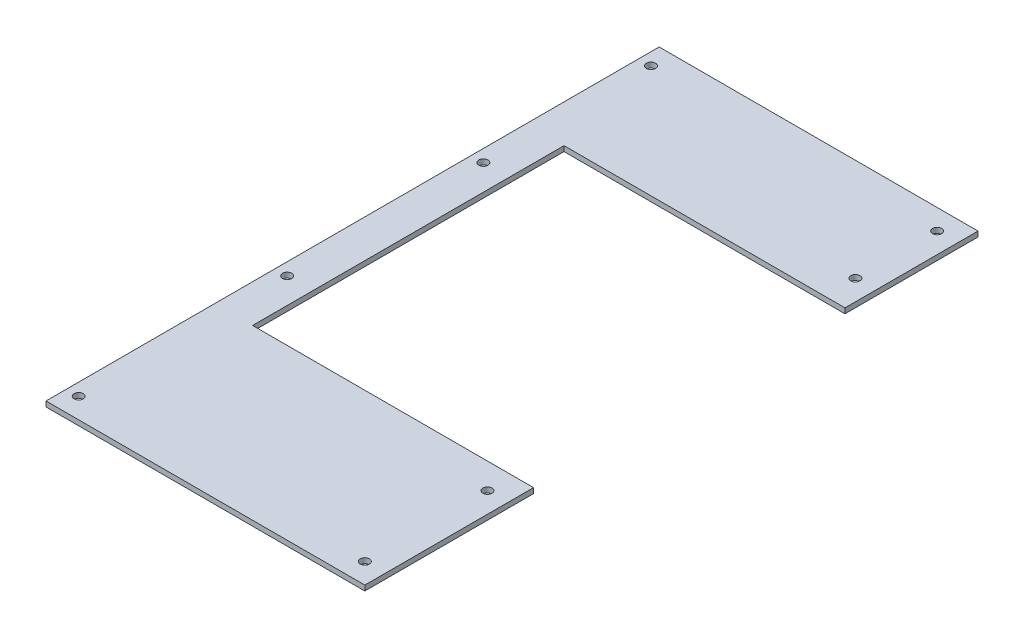
ISO-10303-21;
HEADER;
FILE_DESCRIPTION(('STEP AP214'),'2;1');
FILE_NAME('part.step','',(''),(''),'','','');
FILE_SCHEMA(('AUTOMOTIVE_DESIGN { 1 0 10303 214 1 1 1 1 }'));
ENDSEC;
DATA;
#1=APPLICATION_CONTEXT('core data for automotive mechanical design processes');
#2=APPLICATION_PROTOCOL_DEFINITION('international standard','automotive_design',2000,#1);
#3=PRODUCT_CONTEXT('',#1,'mechanical');
#4=PRODUCT('Part','Part','',(#3));
#5=PRODUCT_RELATED_PRODUCT_CATEGORY('part','',(#4));
#6=PRODUCT_DEFINITION_FORMATION('','',#4);
#7=PRODUCT_DEFINITION_CONTEXT('part definition',#1,'design');
#8=PRODUCT_DEFINITION('design','',#6,#7);
#9=PRODUCT_DEFINITION_SHAPE('','',#8);
#10=(LENGTH_UNIT() NAMED_UNIT(*) SI_UNIT(.MILLI.,.METRE.));
#11=(NAMED_UNIT(*) PLANE_ANGLE_UNIT() SI_UNIT($,.RADIAN.));
#12=(NAMED_UNIT(*) SI_UNIT($,.STERADIAN.) SOLID_ANGLE_UNIT());
#13=UNCERTAINTY_MEASURE_WITH_UNIT(LENGTH_MEASURE(1.E-05),#10,'distance_accuracy_value','');
#14=(GEOMETRIC_REPRESENTATION_CONTEXT(3) GLOBAL_UNCERTAINTY_ASSIGNED_CONTEXT((#13)) GLOBAL_UNIT_ASSIGNED_CONTEXT((#10,
#11,#12)) REPRESENTATION_CONTEXT('',''));
#15=CARTESIAN_POINT('',(0.,0.,0.));
#16=DIRECTION('',(0.,0.,1.));
#17=DIRECTION('',(1.,0.,0.));
#18=AXIS2_PLACEMENT_3D('',#15,#16,#17);
#19=CARTESIAN_POINT('',(0.,3.175,0.));
#20=DIRECTION('',(1.,0.,0.));
#21=DIRECTION('',(0.,0.,-1.));
#22=AXIS2_PLACEMENT_3D('',#19,#20,#21);
#23=PLANE('',#22);
#24=DIRECTION('',(0.,0.,1.));
#25=VECTOR('',#24,1.);
#26=CARTESIAN_POINT('',(0.,0.,0.));
#27=LINE('',#26,#25);
#28=CARTESIAN_POINT('',(0.,0.,0.));
#29=VERTEX_POINT('',#28);
#30=CARTESIAN_POINT('',(0.,0.,81.3500000000002));
#31=VERTEX_POINT('',#30);
#32=EDGE_CURVE('E197',#29,#31,#27,.T.);
#33=ORIENTED_EDGE('',*,*,#32,.F.);
#34=DIRECTION('',(0.,-1.,0.));
#35=VECTOR('',#34,1.);
#36=CARTESIAN_POINT('',(0.,3.175,0.));
#37=LINE('',#36,#35);
#38=CARTESIAN_POINT('',(0.,3.175,0.));
#39=VERTEX_POINT('',#38);
#40=EDGE_CURVE('E11',#39,#29,#37,.T.);
#41=ORIENTED_EDGE('',*,*,#40,.F.);
#42=DIRECTION('',(0.,0.,1.));
#43=VECTOR('',#42,1.);
#44=CARTESIAN_POINT('',(0.,3.175,0.));
#45=LINE('',#44,#43);
#46=CARTESIAN_POINT('',(0.,3.175,81.3500000000002));
#47=VERTEX_POINT('',#46);
#48=EDGE_CURVE('E153',#39,#47,#45,.T.);
#49=ORIENTED_EDGE('',*,*,#48,.T.);
#50=DIRECTION('',(0.,1.,0.));
#51=VECTOR('',#50,1.);
#52=CARTESIAN_POINT('',(0.,0.,81.3500000000002));
#53=LINE('',#52,#51);
#54=EDGE_CURVE('E189',#31,#47,#53,.T.);
#55=ORIENTED_EDGE('',*,*,#54,.F.);
#56=EDGE_LOOP('',(#33,#41,#49,#55));
#57=FACE_BOUND('',#56,.T.);
#58=ADVANCED_FACE('F46',(#57),#23,.T.);
#59=CARTESIAN_POINT('',(0.,3.175,-5.20417042793042E-13));
#60=DIRECTION('',(0.,0.,-1.));
#61=DIRECTION('',(-1.,0.,0.));
#62=AXIS2_PLACEMENT_3D('',#59,#60,#61);
#63=PLANE('',#62);
#64=DIRECTION('',(0.,1.,0.));
#65=VECTOR('',#64,1.);
#66=CARTESIAN_POINT('',(-195.,0.,-1.31838984174237E-13));
#67=LINE('',#66,#65);
#68=CARTESIAN_POINT('',(-195.,0.,-1.41553435639707E-13));
#69=VERTEX_POINT('',#68);
#70=CARTESIAN_POINT('',(-195.,3.175,-1.31838984174237E-13));
#71=VERTEX_POINT('',#70);
#72=EDGE_CURVE('E62',#69,#71,#67,.T.);
#73=ORIENTED_EDGE('',*,*,#72,.T.);
#74=DIRECTION('',(1.,0.,0.));
#75=VECTOR('',#74,1.);
#76=CARTESIAN_POINT('',(0.,3.175,-5.20417042793042E-13));
#77=LINE('',#76,#75);
#78=EDGE_CURVE('E157',#71,#39,#77,.T.);
#79=ORIENTED_EDGE('',*,*,#78,.T.);
#80=ORIENTED_EDGE('',*,*,#40,.T.);
#81=DIRECTION('',(1.,0.,0.));
#82=VECTOR('',#81,1.);
#83=CARTESIAN_POINT('',(0.,0.,-5.20417042793042E-13));
#84=LINE('',#83,#82);
#85=EDGE_CURVE('E102',#69,#29,#84,.T.);
#86=ORIENTED_EDGE('',*,*,#85,.F.);
#87=EDGE_LOOP('',(#73,#79,#80,#86));
#88=FACE_BOUND('',#87,.T.);
#89=ADVANCED_FACE('F208',(#88),#63,.T.);
#90=CARTESIAN_POINT('',(0.,3.175,375.));
#91=DIRECTION('',(0.,0.,1.));
#92=DIRECTION('',(1.,0.,0.));
#93=AXIS2_PLACEMENT_3D('',#90,#91,#92);
#94=PLANE('',#93);
#95=DIRECTION('',(0.,1.,0.));
#96=VECTOR('',#95,1.);
#97=CARTESIAN_POINT('',(-195.,0.,375.));
#98=LINE('',#97,#96);
#99=CARTESIAN_POINT('',(-195.,0.,375.));
#100=VERTEX_POINT('',#99);
#101=CARTESIAN_POINT('',(-195.,3.175,375.));
#102=VERTEX_POINT('',#101);
#103=EDGE_CURVE('E99',#100,#102,#98,.T.);
#104=ORIENTED_EDGE('',*,*,#103,.F.);
#105=DIRECTION('',(-1.,0.,0.));
#106=VECTOR('',#105,1.);
#107=CARTESIAN_POINT('',(0.,0.,375.));
#108=LINE('',#107,#106);
#109=CARTESIAN_POINT('',(0.,0.,375.));
#110=VERTEX_POINT('',#109);
#111=EDGE_CURVE('E95',#110,#100,#108,.T.);
#112=ORIENTED_EDGE('',*,*,#111,.F.);
#113=DIRECTION('',(0.,-1.,0.));
#114=VECTOR('',#113,1.);
#115=CARTESIAN_POINT('',(0.,3.175,375.));
#116=LINE('',#115,#114);
#117=CARTESIAN_POINT('',(0.,3.175,375.));
#118=VERTEX_POINT('',#117);
#119=EDGE_CURVE('E55',#118,#110,#116,.T.);
#120=ORIENTED_EDGE('',*,*,#119,.F.);
#121=DIRECTION('',(-1.,0.,0.));
#122=VECTOR('',#121,1.);
#123=CARTESIAN_POINT('',(0.,3.175,375.));
#124=LINE('',#123,#122);
#125=EDGE_CURVE('E160',#118,#102,#124,.T.);
#126=ORIENTED_EDGE('',*,*,#125,.T.);
#127=EDGE_LOOP('',(#104,#112,#120,#126));
#128=FACE_BOUND('',#127,.T.);
#129=ADVANCED_FACE('F96',(#128),#94,.T.);
#130=CARTESIAN_POINT('',(-12.5,3.175,12.5));
#131=DIRECTION('',(0.,-1.,0.));
#132=DIRECTION('',(0.,0.,-1.));
#133=AXIS2_PLACEMENT_3D('',#130,#131,#132);
#134=CYLINDRICAL_SURFACE('',#133,2.8);
#135=CARTESIAN_POINT('',(-12.5,3.175,12.5));
#136=DIRECTION('',(0.,1.,0.));
#137=DIRECTION('',(0.,0.,1.));
#138=AXIS2_PLACEMENT_3D('',#135,#136,#137);
#139=CIRCLE('',#138,2.8);
#140=CARTESIAN_POINT('',(-12.5,3.175,15.3));
#141=VERTEX_POINT('',#140);
#142=EDGE_CURVE('E177',#141,#141,#139,.T.);
#143=ORIENTED_EDGE('',*,*,#142,.T.);
#144=EDGE_LOOP('',(#143));
#145=FACE_BOUND('',#144,.T.);
#146=CARTESIAN_POINT('',(-12.5,0.,12.5));
#147=DIRECTION('',(0.,1.,0.));
#148=DIRECTION('',(0.,0.,1.));
#149=AXIS2_PLACEMENT_3D('',#146,#147,#148);
#150=CIRCLE('',#149,2.8);
#151=CARTESIAN_POINT('',(-12.5,0.,15.3));
#152=VERTEX_POINT('',#151);
#153=EDGE_CURVE('E126',#152,#152,#150,.T.);
#154=ORIENTED_EDGE('',*,*,#153,.F.);
#155=EDGE_LOOP('',(#154));
#156=FACE_BOUND('',#155,.T.);
#157=ADVANCED_FACE('F333',(#145,#156),#134,.F.);
#158=CARTESIAN_POINT('',(-187.5,3.175,12.5));
#159=DIRECTION('',(0.,-1.,0.));
#160=DIRECTION('',(0.,0.,-1.));
#161=AXIS2_PLACEMENT_3D('',#158,#159,#160);
#162=CYLINDRICAL_SURFACE('',#161,2.8);
#163=CARTESIAN_POINT('',(-187.5,3.175,12.5));
#164=DIRECTION('',(0.,1.,0.));
#165=DIRECTION('',(0.,0.,1.));
#166=AXIS2_PLACEMENT_3D('',#163,#164,#165);
#167=CIRCLE('',#166,2.8);
#168=CARTESIAN_POINT('',(-187.5,3.175,15.3));
#169=VERTEX_POINT('',#168);
#170=EDGE_CURVE('E173',#169,#169,#167,.T.);
#171=ORIENTED_EDGE('',*,*,#170,.T.);
#172=EDGE_LOOP('',(#171));
#173=FACE_BOUND('',#172,.T.);
#174=CARTESIAN_POINT('',(-187.5,0.,12.5));
#175=DIRECTION('',(0.,1.,0.));
#176=DIRECTION('',(0.,0.,1.));
#177=AXIS2_PLACEMENT_3D('',#174,#175,#176);
#178=CIRCLE('',#177,2.8);
#179=CARTESIAN_POINT('',(-187.5,0.,15.3));
#180=VERTEX_POINT('',#179);
#181=EDGE_CURVE('E122',#180,#180,#178,.T.);
#182=ORIENTED_EDGE('',*,*,#181,.F.);
#183=EDGE_LOOP('',(#182));
#184=FACE_BOUND('',#183,.T.);
#185=ADVANCED_FACE('F336',(#173,#184),#162,.F.);
#186=CARTESIAN_POINT('',(-187.5,3.175,235.));
#187=DIRECTION('',(0.,-1.,0.));
#188=DIRECTION('',(0.,0.,-1.));
#189=AXIS2_PLACEMENT_3D('',#186,#187,#188);
#190=CYLINDRICAL_SURFACE('',#189,2.80000000000007);
#191=CARTESIAN_POINT('',(-187.5,3.175,235.));
#192=DIRECTION('',(0.,1.,0.));
#193=DIRECTION('',(0.,0.,1.));
#194=AXIS2_PLACEMENT_3D('',#191,#192,#193);
#195=CIRCLE('',#194,2.80000000000007);
#196=CARTESIAN_POINT('',(-187.5,3.175,237.8));
#197=VERTEX_POINT('',#196);
#198=EDGE_CURVE('E169',#197,#197,#195,.T.);
#199=ORIENTED_EDGE('',*,*,#198,.T.);
#200=EDGE_LOOP('',(#199));
#201=FACE_BOUND('',#200,.T.);
#202=CARTESIAN_POINT('',(-187.5,0.,235.));
#203=DIRECTION('',(0.,1.,0.));
#204=DIRECTION('',(0.,0.,1.));
#205=AXIS2_PLACEMENT_3D('',#202,#203,#204);
#206=CIRCLE('',#205,2.80000000000007);
#207=CARTESIAN_POINT('',(-187.5,0.,237.8));
#208=VERTEX_POINT('',#207);
#209=EDGE_CURVE('E115',#208,#208,#206,.T.);
#210=ORIENTED_EDGE('',*,*,#209,.F.);
#211=EDGE_LOOP('',(#210));
#212=FACE_BOUND('',#211,.T.);
#213=ADVANCED_FACE('F340',(#201,#212),#190,.F.);
#214=CARTESIAN_POINT('',(-187.5,3.175,115.));
#215=DIRECTION('',(0.,-1.,0.));
#216=DIRECTION('',(0.,0.,-1.));
#217=AXIS2_PLACEMENT_3D('',#214,#215,#216);
#218=CYLINDRICAL_SURFACE('',#217,2.8);
#219=CARTESIAN_POINT('',(-187.5,3.175,115.));
#220=DIRECTION('',(0.,1.,0.));
#221=DIRECTION('',(0.,0.,1.));
#222=AXIS2_PLACEMENT_3D('',#219,#220,#221);
#223=CIRCLE('',#222,2.8);
#224=CARTESIAN_POINT('',(-187.5,3.175,117.8));
#225=VERTEX_POINT('',#224);
#226=EDGE_CURVE('E165',#225,#225,#223,.T.);
#227=ORIENTED_EDGE('',*,*,#226,.T.);
#228=EDGE_LOOP('',(#227));
#229=FACE_BOUND('',#228,.T.);
#230=CARTESIAN_POINT('',(-187.5,0.,115.));
#231=DIRECTION('',(0.,1.,0.));
#232=DIRECTION('',(0.,0.,1.));
#233=AXIS2_PLACEMENT_3D('',#230,#231,#232);
#234=CIRCLE('',#233,2.8);
#235=CARTESIAN_POINT('',(-187.5,0.,117.8));
#236=VERTEX_POINT('',#235);
#237=EDGE_CURVE('E111',#236,#236,#234,.T.);
#238=ORIENTED_EDGE('',*,*,#237,.F.);
#239=EDGE_LOOP('',(#238));
#240=FACE_BOUND('',#239,.T.);
#241=ADVANCED_FACE('F344',(#229,#240),#218,.F.);
#242=CARTESIAN_POINT('',(0.,3.175,0.));
#243=DIRECTION('',(1.,0.,0.));
#244=DIRECTION('',(0.,0.,-1.));
#245=AXIS2_PLACEMENT_3D('',#242,#243,#244);
#246=PLANE('',#245);
#247=DIRECTION('',(0.,0.,1.));
#248=VECTOR('',#247,1.);
#249=CARTESIAN_POINT('',(0.,0.,0.));
#250=LINE('',#249,#248);
#251=CARTESIAN_POINT('',(0.,0.,271.825));
#252=VERTEX_POINT('',#251);
#253=EDGE_CURVE('E87',#252,#110,#250,.T.);
#254=ORIENTED_EDGE('',*,*,#253,.F.);
#255=DIRECTION('',(0.,1.,0.));
#256=VECTOR('',#255,1.);
#257=CARTESIAN_POINT('',(0.,0.,271.825));
#258=LINE('',#257,#256);
#259=CARTESIAN_POINT('',(0.,3.175,271.825));
#260=VERTEX_POINT('',#259);
#261=EDGE_CURVE('E147',#252,#260,#258,.T.);
#262=ORIENTED_EDGE('',*,*,#261,.T.);
#263=DIRECTION('',(0.,0.,1.));
#264=VECTOR('',#263,1.);
#265=CARTESIAN_POINT('',(0.,3.175,0.));
#266=LINE('',#265,#264);
#267=EDGE_CURVE('E90',#260,#118,#266,.T.);
#268=ORIENTED_EDGE('',*,*,#267,.T.);
#269=ORIENTED_EDGE('',*,*,#119,.T.);
#270=EDGE_LOOP('',(#254,#262,#268,#269));
#271=FACE_BOUND('',#270,.T.);
#272=ADVANCED_FACE('F83',(#271),#246,.T.);
#273=CARTESIAN_POINT('',(-12.4999999999999,3.175,362.5));
#274=DIRECTION('',(0.,-1.,0.));
#275=DIRECTION('',(0.,0.,-1.));
#276=AXIS2_PLACEMENT_3D('',#273,#274,#275);
#277=CYLINDRICAL_SURFACE('',#276,2.80000000000001);
#278=CARTESIAN_POINT('',(-12.4999999999999,3.175,362.5));
#279=DIRECTION('',(0.,1.,0.));
#280=DIRECTION('',(0.,0.,1.));
#281=AXIS2_PLACEMENT_3D('',#278,#279,#280);
#282=CIRCLE('',#281,2.80000000000001);
#283=CARTESIAN_POINT('',(-12.4999999999999,3.175,365.3));
#284=VERTEX_POINT('',#283);
#285=EDGE_CURVE('E144',#284,#284,#282,.T.);
#286=ORIENTED_EDGE('',*,*,#285,.T.);
#287=EDGE_LOOP('',(#286));
#288=FACE_BOUND('',#287,.T.);
#289=CARTESIAN_POINT('',(-12.4999999999999,0.,362.5));
#290=DIRECTION('',(0.,1.,0.));
#291=DIRECTION('',(0.,0.,1.));
#292=AXIS2_PLACEMENT_3D('',#289,#290,#291);
#293=CIRCLE('',#292,2.80000000000001);
#294=CARTESIAN_POINT('',(-12.4999999999999,0.,365.3));
#295=VERTEX_POINT('',#294);
#296=EDGE_CURVE('E193',#295,#295,#293,.T.);
#297=ORIENTED_EDGE('',*,*,#296,.F.);
#298=EDGE_LOOP('',(#297));
#299=FACE_BOUND('',#298,.T.);
#300=ADVANCED_FACE('F306',(#288,#299),#277,.F.);
#301=CARTESIAN_POINT('',(-12.4999999999999,3.175,287.5));
#302=DIRECTION('',(0.,-1.,0.));
#303=DIRECTION('',(0.,0.,-1.));
#304=AXIS2_PLACEMENT_3D('',#301,#302,#303);
#305=CYLINDRICAL_SURFACE('',#304,2.80000000000001);
#306=CARTESIAN_POINT('',(-12.4999999999999,3.175,287.5));
#307=DIRECTION('',(0.,1.,0.));
#308=DIRECTION('',(0.,0.,1.));
#309=AXIS2_PLACEMENT_3D('',#306,#307,#308);
#310=CIRCLE('',#309,2.80000000000001);
#311=CARTESIAN_POINT('',(-12.4999999999999,3.175,290.3));
#312=VERTEX_POINT('',#311);
#313=EDGE_CURVE('E138',#312,#312,#310,.T.);
#314=ORIENTED_EDGE('',*,*,#313,.T.);
#315=EDGE_LOOP('',(#314));
#316=FACE_BOUND('',#315,.T.);
#317=CARTESIAN_POINT('',(-12.4999999999999,0.,287.5));
#318=DIRECTION('',(0.,1.,0.));
#319=DIRECTION('',(0.,0.,1.));
#320=AXIS2_PLACEMENT_3D('',#317,#318,#319);
#321=CIRCLE('',#320,2.80000000000001);
#322=CARTESIAN_POINT('',(-12.4999999999999,0.,290.3));
#323=VERTEX_POINT('',#322);
#324=EDGE_CURVE('E188',#323,#323,#321,.T.);
#325=ORIENTED_EDGE('',*,*,#324,.F.);
#326=EDGE_LOOP('',(#325));
#327=FACE_BOUND('',#326,.T.);
#328=ADVANCED_FACE('F308',(#316,#327),#305,.F.);
#329=CARTESIAN_POINT('',(-187.5,3.175,362.5));
#330=DIRECTION('',(0.,-1.,0.));
#331=DIRECTION('',(0.,0.,-1.));
#332=AXIS2_PLACEMENT_3D('',#329,#330,#331);
#333=CYLINDRICAL_SURFACE('',#332,2.80000000000001);
#334=CARTESIAN_POINT('',(-187.5,3.175,362.5));
#335=DIRECTION('',(0.,1.,0.));
#336=DIRECTION('',(0.,0.,1.));
#337=AXIS2_PLACEMENT_3D('',#334,#335,#336);
#338=CIRCLE('',#337,2.80000000000001);
#339=CARTESIAN_POINT('',(-187.5,3.175,365.3));
#340=VERTEX_POINT('',#339);
#341=EDGE_CURVE('E133',#340,#340,#338,.T.);
#342=ORIENTED_EDGE('',*,*,#341,.T.);
#343=EDGE_LOOP('',(#342));
#344=FACE_BOUND('',#343,.T.);
#345=CARTESIAN_POINT('',(-187.5,0.,362.5));
#346=DIRECTION('',(0.,1.,0.));
#347=DIRECTION('',(0.,0.,1.));
#348=AXIS2_PLACEMENT_3D('',#345,#346,#347);
#349=CIRCLE('',#348,2.80000000000001);
#350=CARTESIAN_POINT('',(-187.5,0.,365.3));
#351=VERTEX_POINT('',#350);
#352=EDGE_CURVE('E184',#351,#351,#349,.T.);
#353=ORIENTED_EDGE('',*,*,#352,.F.);
#354=EDGE_LOOP('',(#353));
#355=FACE_BOUND('',#354,.T.);
#356=ADVANCED_FACE('F48',(#344,#355),#333,.F.);
#357=CARTESIAN_POINT('',(-12.5,3.175,62.5));
#358=DIRECTION('',(0.,-1.,0.));
#359=DIRECTION('',(0.,0.,-1.));
#360=AXIS2_PLACEMENT_3D('',#357,#358,#359);
#361=CYLINDRICAL_SURFACE('',#360,2.8);
#362=CARTESIAN_POINT('',(-12.5,3.175,62.5));
#363=DIRECTION('',(0.,1.,0.));
#364=DIRECTION('',(0.,0.,1.));
#365=AXIS2_PLACEMENT_3D('',#362,#363,#364);
#366=CIRCLE('',#365,2.8);
#367=CARTESIAN_POINT('',(-12.5,3.175,65.3));
#368=VERTEX_POINT('',#367);
#369=EDGE_CURVE('E92',#368,#368,#366,.T.);
#370=ORIENTED_EDGE('',*,*,#369,.T.);
#371=EDGE_LOOP('',(#370));
#372=FACE_BOUND('',#371,.T.);
#373=CARTESIAN_POINT('',(-12.5,0.,62.5));
#374=DIRECTION('',(0.,1.,0.));
#375=DIRECTION('',(0.,0.,1.));
#376=AXIS2_PLACEMENT_3D('',#373,#374,#375);
#377=CIRCLE('',#376,2.8);
#378=CARTESIAN_POINT('',(-12.5,0.,65.3));
#379=VERTEX_POINT('',#378);
#380=EDGE_CURVE('E130',#379,#379,#377,.T.);
#381=ORIENTED_EDGE('',*,*,#380,.F.);
#382=EDGE_LOOP('',(#381));
#383=FACE_BOUND('',#382,.T.);
#384=ADVANCED_FACE('F315',(#372,#383),#361,.F.);
#385=CARTESIAN_POINT('',(0.,3.175,0.));
#386=DIRECTION('',(0.,1.,0.));
#387=DIRECTION('',(0.,0.,1.));
#388=AXIS2_PLACEMENT_3D('',#385,#386,#387);
#389=PLANE('',#388);
#390=DIRECTION('',(0.,0.,-1.));
#391=VECTOR('',#390,1.);
#392=CARTESIAN_POINT('',(-195.,3.175,375.));
#393=LINE('',#392,#391);
#394=EDGE_CURVE('E279',#102,#71,#393,.T.);
#395=ORIENTED_EDGE('',*,*,#394,.F.);
#396=ORIENTED_EDGE('',*,*,#125,.F.);
#397=ORIENTED_EDGE('',*,*,#267,.F.);
#398=DIRECTION('',(-1.,0.,0.));
#399=VECTOR('',#398,1.);
#400=CARTESIAN_POINT('',(0.,3.175,271.825));
#401=LINE('',#400,#399);
#402=CARTESIAN_POINT('',(-171.825,3.175,271.825));
#403=VERTEX_POINT('',#402);
#404=EDGE_CURVE('E237',#260,#403,#401,.T.);
#405=ORIENTED_EDGE('',*,*,#404,.T.);
#406=DIRECTION('',(0.,0.,-1.));
#407=VECTOR('',#406,1.);
#408=CARTESIAN_POINT('',(-171.825,3.175,0.));
#409=LINE('',#408,#407);
#410=CARTESIAN_POINT('',(-171.825,3.175,81.3500000000002));
#411=VERTEX_POINT('',#410);
#412=EDGE_CURVE('E241',#403,#411,#409,.T.);
#413=ORIENTED_EDGE('',*,*,#412,.T.);
#414=DIRECTION('',(-1.,0.,0.));
#415=VECTOR('',#414,1.);
#416=CARTESIAN_POINT('',(0.,3.175,81.3500000000002));
#417=LINE('',#416,#415);
#418=EDGE_CURVE('E245',#47,#411,#417,.T.);
#419=ORIENTED_EDGE('',*,*,#418,.F.);
#420=ORIENTED_EDGE('',*,*,#48,.F.);
#421=ORIENTED_EDGE('',*,*,#78,.F.);
#422=EDGE_LOOP('',(#395,#396,#397,#405,#413,#419,#420,#421));
#423=FACE_BOUND('',#422,.T.);
#424=ORIENTED_EDGE('',*,*,#341,.F.);
#425=EDGE_LOOP('',(#424));
#426=FACE_BOUND('',#425,.T.);
#427=ORIENTED_EDGE('',*,*,#313,.F.);
#428=EDGE_LOOP('',(#427));
#429=FACE_BOUND('',#428,.T.);
#430=ORIENTED_EDGE('',*,*,#285,.F.);
#431=EDGE_LOOP('',(#430));
#432=FACE_BOUND('',#431,.T.);
#433=ORIENTED_EDGE('',*,*,#226,.F.);
#434=EDGE_LOOP('',(#433));
#435=FACE_BOUND('',#434,.T.);
#436=ORIENTED_EDGE('',*,*,#198,.F.);
#437=EDGE_LOOP('',(#436));
#438=FACE_BOUND('',#437,.T.);
#439=ORIENTED_EDGE('',*,*,#170,.F.);
#440=EDGE_LOOP('',(#439));
#441=FACE_BOUND('',#440,.T.);
#442=ORIENTED_EDGE('',*,*,#142,.F.);
#443=EDGE_LOOP('',(#442));
#444=FACE_BOUND('',#443,.T.);
#445=ORIENTED_EDGE('',*,*,#369,.F.);
#446=EDGE_LOOP('',(#445));
#447=FACE_BOUND('',#446,.T.);
#448=ADVANCED_FACE('F265',(#423,#426,#429,#432,#435,#438,#441,#444,#447),#389,.T.);
#449=CARTESIAN_POINT('',(0.,0.,0.));
#450=DIRECTION('',(0.,1.,0.));
#451=DIRECTION('',(0.,0.,1.));
#452=AXIS2_PLACEMENT_3D('',#449,#450,#451);
#453=PLANE('',#452);
#454=ORIENTED_EDGE('',*,*,#352,.T.);
#455=EDGE_LOOP('',(#454));
#456=FACE_BOUND('',#455,.T.);
#457=ORIENTED_EDGE('',*,*,#324,.T.);
#458=EDGE_LOOP('',(#457));
#459=FACE_BOUND('',#458,.T.);
#460=ORIENTED_EDGE('',*,*,#296,.T.);
#461=EDGE_LOOP('',(#460));
#462=FACE_BOUND('',#461,.T.);
#463=ORIENTED_EDGE('',*,*,#111,.T.);
#464=DIRECTION('',(0.,0.,-1.));
#465=VECTOR('',#464,1.);
#466=CARTESIAN_POINT('',(-195.,0.,375.));
#467=LINE('',#466,#465);
#468=EDGE_CURVE('E205',#100,#69,#467,.T.);
#469=ORIENTED_EDGE('',*,*,#468,.T.);
#470=ORIENTED_EDGE('',*,*,#85,.T.);
#471=ORIENTED_EDGE('',*,*,#32,.T.);
#472=DIRECTION('',(-1.,0.,0.));
#473=VECTOR('',#472,1.);
#474=CARTESIAN_POINT('',(0.,0.,81.3500000000002));
#475=LINE('',#474,#473);
#476=CARTESIAN_POINT('',(-171.825,0.,81.3500000000002));
#477=VERTEX_POINT('',#476);
#478=EDGE_CURVE('E224',#31,#477,#475,.T.);
#479=ORIENTED_EDGE('',*,*,#478,.T.);
#480=DIRECTION('',(0.,0.,-1.));
#481=VECTOR('',#480,1.);
#482=CARTESIAN_POINT('',(-171.825,0.,0.));
#483=LINE('',#482,#481);
#484=CARTESIAN_POINT('',(-171.825,0.,271.825));
#485=VERTEX_POINT('',#484);
#486=EDGE_CURVE('E229',#485,#477,#483,.T.);
#487=ORIENTED_EDGE('',*,*,#486,.F.);
#488=DIRECTION('',(-1.,0.,0.));
#489=VECTOR('',#488,1.);
#490=CARTESIAN_POINT('',(0.,0.,271.825));
#491=LINE('',#490,#489);
#492=EDGE_CURVE('E109',#252,#485,#491,.T.);
#493=ORIENTED_EDGE('',*,*,#492,.F.);
#494=ORIENTED_EDGE('',*,*,#253,.T.);
#495=EDGE_LOOP('',(#463,#469,#470,#471,#479,#487,#493,#494));
#496=FACE_BOUND('',#495,.T.);
#497=ORIENTED_EDGE('',*,*,#237,.T.);
#498=EDGE_LOOP('',(#497));
#499=FACE_BOUND('',#498,.T.);
#500=ORIENTED_EDGE('',*,*,#209,.T.);
#501=EDGE_LOOP('',(#500));
#502=FACE_BOUND('',#501,.T.);
#503=ORIENTED_EDGE('',*,*,#181,.T.);
#504=EDGE_LOOP('',(#503));
#505=FACE_BOUND('',#504,.T.);
#506=ORIENTED_EDGE('',*,*,#153,.T.);
#507=EDGE_LOOP('',(#506));
#508=FACE_BOUND('',#507,.T.);
#509=ORIENTED_EDGE('',*,*,#380,.T.);
#510=EDGE_LOOP('',(#509));
#511=FACE_BOUND('',#510,.T.);
#512=ADVANCED_FACE('F105',(#456,#459,#462,#496,#499,#502,#505,#508,#511),#453,.F.);
#513=CARTESIAN_POINT('',(0.,0.,81.3500000000002));
#514=DIRECTION('',(0.,0.,-1.));
#515=DIRECTION('',(-1.,0.,0.));
#516=AXIS2_PLACEMENT_3D('',#513,#514,#515);
#517=PLANE('',#516);
#518=ORIENTED_EDGE('',*,*,#418,.T.);
#519=DIRECTION('',(0.,1.,0.));
#520=VECTOR('',#519,1.);
#521=CARTESIAN_POINT('',(-171.825,0.,81.3500000000002));
#522=LINE('',#521,#520);
#523=EDGE_CURVE('E221',#477,#411,#522,.T.);
#524=ORIENTED_EDGE('',*,*,#523,.F.);
#525=ORIENTED_EDGE('',*,*,#478,.F.);
#526=ORIENTED_EDGE('',*,*,#54,.T.);
#527=EDGE_LOOP('',(#518,#524,#525,#526));
#528=FACE_BOUND('',#527,.T.);
#529=ADVANCED_FACE('F225',(#528),#517,.F.);
#530=CARTESIAN_POINT('',(-171.825,0.,0.));
#531=DIRECTION('',(1.,0.,0.));
#532=DIRECTION('',(0.,0.,-1.));
#533=AXIS2_PLACEMENT_3D('',#530,#531,#532);
#534=PLANE('',#533);
#535=ORIENTED_EDGE('',*,*,#412,.F.);
#536=DIRECTION('',(0.,1.,0.));
#537=VECTOR('',#536,1.);
#538=CARTESIAN_POINT('',(-171.825,0.,271.825));
#539=LINE('',#538,#537);
#540=EDGE_CURVE('E233',#485,#403,#539,.T.);
#541=ORIENTED_EDGE('',*,*,#540,.F.);
#542=ORIENTED_EDGE('',*,*,#486,.T.);
#543=ORIENTED_EDGE('',*,*,#523,.T.);
#544=EDGE_LOOP('',(#535,#541,#542,#543));
#545=FACE_BOUND('',#544,.T.);
#546=ADVANCED_FACE('F262',(#545),#534,.T.);
#547=CARTESIAN_POINT('',(0.,0.,271.825));
#548=DIRECTION('',(0.,0.,-1.));
#549=DIRECTION('',(-1.,0.,0.));
#550=AXIS2_PLACEMENT_3D('',#547,#548,#549);
#551=PLANE('',#550);
#552=ORIENTED_EDGE('',*,*,#404,.F.);
#553=ORIENTED_EDGE('',*,*,#261,.F.);
#554=ORIENTED_EDGE('',*,*,#492,.T.);
#555=ORIENTED_EDGE('',*,*,#540,.T.);
#556=EDGE_LOOP('',(#552,#553,#554,#555));
#557=FACE_BOUND('',#556,.T.);
#558=ADVANCED_FACE('F256',(#557),#551,.T.);
#559=CARTESIAN_POINT('',(-195.,0.,375.));
#560=DIRECTION('',(1.,0.,0.));
#561=DIRECTION('',(0.,0.,-1.));
#562=AXIS2_PLACEMENT_3D('',#559,#560,#561);
#563=PLANE('',#562);
#564=ORIENTED_EDGE('',*,*,#394,.T.);
#565=ORIENTED_EDGE('',*,*,#72,.F.);
#566=ORIENTED_EDGE('',*,*,#468,.F.);
#567=ORIENTED_EDGE('',*,*,#103,.T.);
#568=EDGE_LOOP('',(#564,#565,#566,#567));
#569=FACE_BOUND('',#568,.T.);
#570=ADVANCED_FACE('F277',(#569),#563,.F.);
#571=CLOSED_SHELL('',(#58,#89,#129,#157,#185,#213,#241,#272,#300,#328,#356,#384,#448,#512,#529,
#546,#558,#570));
#572=MANIFOLD_SOLID_BREP('B2',#571);
#573=ADVANCED_BREP_SHAPE_REPRESENTATION('',(#18,#572),#14);
#574=SHAPE_DEFINITION_REPRESENTATION(#9,#573);
ENDSEC;
END-ISO-10303-21;
